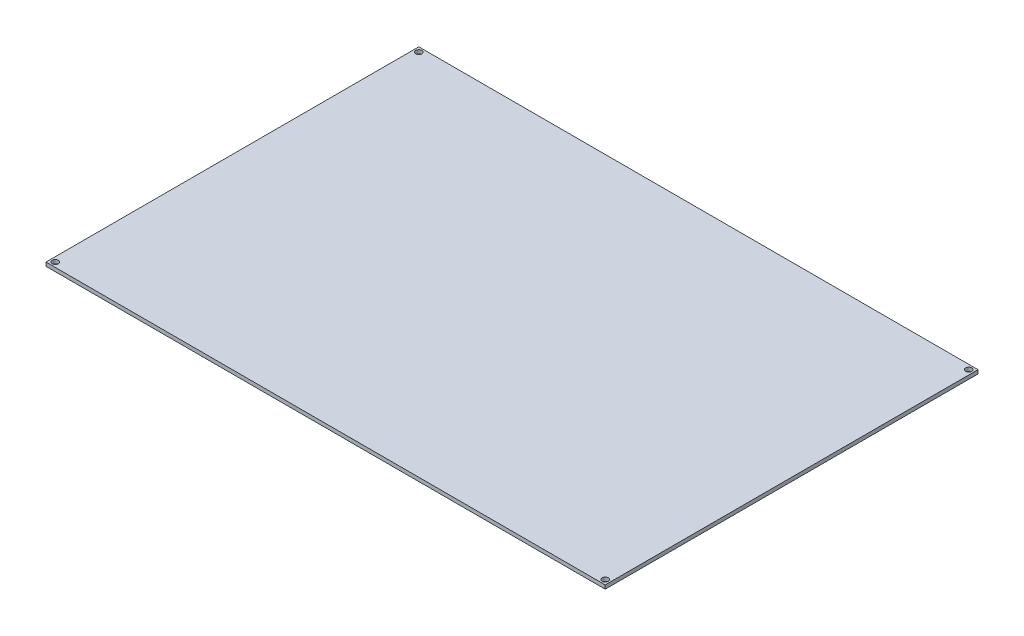
ISO-10303-21;
HEADER;
FILE_DESCRIPTION(('STEP AP214'),'2;1');
FILE_NAME('part.step','',(''),(''),'','','');
FILE_SCHEMA(('AUTOMOTIVE_DESIGN { 1 0 10303 214 1 1 1 1 }'));
ENDSEC;
DATA;
#1=APPLICATION_CONTEXT('core data for automotive mechanical design processes');
#2=APPLICATION_PROTOCOL_DEFINITION('international standard','automotive_design',2000,#1);
#3=PRODUCT_CONTEXT('',#1,'mechanical');
#4=PRODUCT('Part','Part','',(#3));
#5=PRODUCT_RELATED_PRODUCT_CATEGORY('part','',(#4));
#6=PRODUCT_DEFINITION_FORMATION('','',#4);
#7=PRODUCT_DEFINITION_CONTEXT('part definition',#1,'design');
#8=PRODUCT_DEFINITION('design','',#6,#7);
#9=PRODUCT_DEFINITION_SHAPE('','',#8);
#10=(LENGTH_UNIT() NAMED_UNIT(*) SI_UNIT(.MILLI.,.METRE.));
#11=(NAMED_UNIT(*) PLANE_ANGLE_UNIT() SI_UNIT($,.RADIAN.));
#12=(NAMED_UNIT(*) SI_UNIT($,.STERADIAN.) SOLID_ANGLE_UNIT());
#13=UNCERTAINTY_MEASURE_WITH_UNIT(LENGTH_MEASURE(1.E-05),#10,'distance_accuracy_value','');
#14=(GEOMETRIC_REPRESENTATION_CONTEXT(3) GLOBAL_UNCERTAINTY_ASSIGNED_CONTEXT((#13)) GLOBAL_UNIT_ASSIGNED_CONTEXT((#10,
#11,#12)) REPRESENTATION_CONTEXT('',''));
#15=CARTESIAN_POINT('',(0.,0.,0.));
#16=DIRECTION('',(0.,0.,1.));
#17=DIRECTION('',(1.,0.,0.));
#18=AXIS2_PLACEMENT_3D('',#15,#16,#17);
#19=CARTESIAN_POINT('',(0.,2.,0.));
#20=DIRECTION('',(0.,-1.,0.));
#21=DIRECTION('',(0.,0.,-1.));
#22=AXIS2_PLACEMENT_3D('',#19,#20,#21);
#23=PLANE('',#22);
#24=DIRECTION('',(0.,0.,1.));
#25=VECTOR('',#24,1.);
#26=CARTESIAN_POINT('',(0.,2.,0.));
#27=LINE('',#26,#25);
#28=CARTESIAN_POINT('',(0.,2.,-200.));
#29=VERTEX_POINT('',#28);
#30=CARTESIAN_POINT('',(0.,2.,0.));
#31=VERTEX_POINT('',#30);
#32=EDGE_CURVE('E84',#29,#31,#27,.T.);
#33=ORIENTED_EDGE('',*,*,#32,.T.);
#34=DIRECTION('',(1.,0.,0.));
#35=VECTOR('',#34,1.);
#36=CARTESIAN_POINT('',(0.,2.,0.));
#37=LINE('',#36,#35);
#38=CARTESIAN_POINT('',(300.,2.,0.));
#39=VERTEX_POINT('',#38);
#40=EDGE_CURVE('E79',#31,#39,#37,.T.);
#41=ORIENTED_EDGE('',*,*,#40,.T.);
#42=DIRECTION('',(0.,0.,-1.));
#43=VECTOR('',#42,1.);
#44=CARTESIAN_POINT('',(300.,2.,0.));
#45=LINE('',#44,#43);
#46=CARTESIAN_POINT('',(300.,2.,-200.));
#47=VERTEX_POINT('',#46);
#48=EDGE_CURVE('E82',#39,#47,#45,.T.);
#49=ORIENTED_EDGE('',*,*,#48,.T.);
#50=DIRECTION('',(-1.,0.,0.));
#51=VECTOR('',#50,1.);
#52=CARTESIAN_POINT('',(0.,2.,-200.));
#53=LINE('',#52,#51);
#54=EDGE_CURVE('E49',#47,#29,#53,.T.);
#55=ORIENTED_EDGE('',*,*,#54,.T.);
#56=EDGE_LOOP('',(#33,#41,#49,#55));
#57=FACE_BOUND('',#56,.T.);
#58=CARTESIAN_POINT('',(2.5,2.,-2.5));
#59=DIRECTION('',(0.,1.,0.));
#60=DIRECTION('',(0.,0.,1.));
#61=AXIS2_PLACEMENT_3D('',#58,#59,#60);
#62=CIRCLE('',#61,1.65);
#63=CARTESIAN_POINT('',(2.5,2.,-0.849999999999999));
#64=VERTEX_POINT('',#63);
#65=EDGE_CURVE('E99',#64,#64,#62,.T.);
#66=ORIENTED_EDGE('',*,*,#65,.F.);
#67=EDGE_LOOP('',(#66));
#68=FACE_BOUND('',#67,.T.);
#69=CARTESIAN_POINT('',(297.5,2.,-2.5));
#70=DIRECTION('',(0.,1.,0.));
#71=DIRECTION('',(0.,0.,-1.));
#72=AXIS2_PLACEMENT_3D('',#69,#70,#71);
#73=CIRCLE('',#72,1.64999999999999);
#74=CARTESIAN_POINT('',(297.5,2.,-4.14999999999999));
#75=VERTEX_POINT('',#74);
#76=EDGE_CURVE('E114',#75,#75,#73,.T.);
#77=ORIENTED_EDGE('',*,*,#76,.F.);
#78=EDGE_LOOP('',(#77));
#79=FACE_BOUND('',#78,.T.);
#80=CARTESIAN_POINT('',(297.5,2.,-197.5));
#81=DIRECTION('',(0.,1.,0.));
#82=DIRECTION('',(0.,0.,1.));
#83=AXIS2_PLACEMENT_3D('',#80,#81,#82);
#84=CIRCLE('',#83,1.64999999999999);
#85=CARTESIAN_POINT('',(297.5,2.,-195.85));
#86=VERTEX_POINT('',#85);
#87=EDGE_CURVE('E120',#86,#86,#84,.T.);
#88=ORIENTED_EDGE('',*,*,#87,.F.);
#89=EDGE_LOOP('',(#88));
#90=FACE_BOUND('',#89,.T.);
#91=CARTESIAN_POINT('',(2.5,2.,-197.5));
#92=DIRECTION('',(0.,1.,0.));
#93=DIRECTION('',(0.,0.,-1.));
#94=AXIS2_PLACEMENT_3D('',#91,#92,#93);
#95=CIRCLE('',#94,1.65);
#96=CARTESIAN_POINT('',(2.5,2.,-199.15));
#97=VERTEX_POINT('',#96);
#98=EDGE_CURVE('E126',#97,#97,#95,.T.);
#99=ORIENTED_EDGE('',*,*,#98,.F.);
#100=EDGE_LOOP('',(#99));
#101=FACE_BOUND('',#100,.T.);
#102=ADVANCED_FACE('F32',(#57,#68,#79,#90,#101),#23,.F.);
#103=CARTESIAN_POINT('',(0.,0.,0.));
#104=DIRECTION('',(0.,-1.,0.));
#105=DIRECTION('',(0.,0.,-1.));
#106=AXIS2_PLACEMENT_3D('',#103,#104,#105);
#107=PLANE('',#106);
#108=CARTESIAN_POINT('',(297.5,0.,-197.5));
#109=DIRECTION('',(0.,1.,0.));
#110=DIRECTION('',(0.,0.,1.));
#111=AXIS2_PLACEMENT_3D('',#108,#109,#110);
#112=CIRCLE('',#111,1.64999999999999);
#113=CARTESIAN_POINT('',(297.5,0.,-195.85));
#114=VERTEX_POINT('',#113);
#115=EDGE_CURVE('E123',#114,#114,#112,.T.);
#116=ORIENTED_EDGE('',*,*,#115,.T.);
#117=EDGE_LOOP('',(#116));
#118=FACE_BOUND('',#117,.T.);
#119=CARTESIAN_POINT('',(2.5,0.,-2.5));
#120=DIRECTION('',(0.,1.,0.));
#121=DIRECTION('',(0.,0.,1.));
#122=AXIS2_PLACEMENT_3D('',#119,#120,#121);
#123=CIRCLE('',#122,1.65);
#124=CARTESIAN_POINT('',(2.5,0.,-0.849999999999999));
#125=VERTEX_POINT('',#124);
#126=EDGE_CURVE('E111',#125,#125,#123,.T.);
#127=ORIENTED_EDGE('',*,*,#126,.T.);
#128=EDGE_LOOP('',(#127));
#129=FACE_BOUND('',#128,.T.);
#130=DIRECTION('',(0.,0.,1.));
#131=VECTOR('',#130,1.);
#132=CARTESIAN_POINT('',(0.,0.,0.));
#133=LINE('',#132,#131);
#134=CARTESIAN_POINT('',(0.,0.,-200.));
#135=VERTEX_POINT('',#134);
#136=CARTESIAN_POINT('',(0.,0.,0.));
#137=VERTEX_POINT('',#136);
#138=EDGE_CURVE('E96',#135,#137,#133,.T.);
#139=ORIENTED_EDGE('',*,*,#138,.F.);
#140=DIRECTION('',(-1.,0.,0.));
#141=VECTOR('',#140,1.);
#142=CARTESIAN_POINT('',(0.,0.,-200.));
#143=LINE('',#142,#141);
#144=CARTESIAN_POINT('',(300.,0.,-200.));
#145=VERTEX_POINT('',#144);
#146=EDGE_CURVE('E72',#145,#135,#143,.T.);
#147=ORIENTED_EDGE('',*,*,#146,.F.);
#148=DIRECTION('',(0.,0.,-1.));
#149=VECTOR('',#148,1.);
#150=CARTESIAN_POINT('',(300.,0.,0.));
#151=LINE('',#150,#149);
#152=CARTESIAN_POINT('',(300.,0.,0.));
#153=VERTEX_POINT('',#152);
#154=EDGE_CURVE('E66',#153,#145,#151,.T.);
#155=ORIENTED_EDGE('',*,*,#154,.F.);
#156=DIRECTION('',(1.,0.,0.));
#157=VECTOR('',#156,1.);
#158=CARTESIAN_POINT('',(0.,0.,0.));
#159=LINE('',#158,#157);
#160=EDGE_CURVE('E88',#137,#153,#159,.T.);
#161=ORIENTED_EDGE('',*,*,#160,.F.);
#162=EDGE_LOOP('',(#139,#147,#155,#161));
#163=FACE_BOUND('',#162,.T.);
#164=CARTESIAN_POINT('',(297.5,0.,-2.5));
#165=DIRECTION('',(0.,1.,0.));
#166=DIRECTION('',(0.,0.,-1.));
#167=AXIS2_PLACEMENT_3D('',#164,#165,#166);
#168=CIRCLE('',#167,1.64999999999999);
#169=CARTESIAN_POINT('',(297.5,0.,-4.14999999999999));
#170=VERTEX_POINT('',#169);
#171=EDGE_CURVE('E117',#170,#170,#168,.T.);
#172=ORIENTED_EDGE('',*,*,#171,.T.);
#173=EDGE_LOOP('',(#172));
#174=FACE_BOUND('',#173,.T.);
#175=CARTESIAN_POINT('',(2.5,0.,-197.5));
#176=DIRECTION('',(0.,1.,0.));
#177=DIRECTION('',(0.,0.,-1.));
#178=AXIS2_PLACEMENT_3D('',#175,#176,#177);
#179=CIRCLE('',#178,1.65);
#180=CARTESIAN_POINT('',(2.5,0.,-199.15));
#181=VERTEX_POINT('',#180);
#182=EDGE_CURVE('E129',#181,#181,#179,.T.);
#183=ORIENTED_EDGE('',*,*,#182,.T.);
#184=EDGE_LOOP('',(#183));
#185=FACE_BOUND('',#184,.T.);
#186=ADVANCED_FACE('F107',(#118,#129,#163,#174,#185),#107,.T.);
#187=CARTESIAN_POINT('',(0.,2.,0.));
#188=DIRECTION('',(1.,0.,0.));
#189=DIRECTION('',(0.,0.,-1.));
#190=AXIS2_PLACEMENT_3D('',#187,#188,#189);
#191=PLANE('',#190);
#192=ORIENTED_EDGE('',*,*,#138,.T.);
#193=DIRECTION('',(0.,-1.,0.));
#194=VECTOR('',#193,1.);
#195=CARTESIAN_POINT('',(0.,2.,0.));
#196=LINE('',#195,#194);
#197=EDGE_CURVE('E11',#31,#137,#196,.T.);
#198=ORIENTED_EDGE('',*,*,#197,.F.);
#199=ORIENTED_EDGE('',*,*,#32,.F.);
#200=DIRECTION('',(0.,-1.,0.));
#201=VECTOR('',#200,1.);
#202=CARTESIAN_POINT('',(0.,2.,-200.));
#203=LINE('',#202,#201);
#204=EDGE_CURVE('E92',#29,#135,#203,.T.);
#205=ORIENTED_EDGE('',*,*,#204,.T.);
#206=EDGE_LOOP('',(#192,#198,#199,#205));
#207=FACE_BOUND('',#206,.T.);
#208=ADVANCED_FACE('F34',(#207),#191,.F.);
#209=CARTESIAN_POINT('',(0.,2.,0.));
#210=DIRECTION('',(0.,0.,-1.));
#211=DIRECTION('',(-1.,0.,0.));
#212=AXIS2_PLACEMENT_3D('',#209,#210,#211);
#213=PLANE('',#212);
#214=ORIENTED_EDGE('',*,*,#160,.T.);
#215=DIRECTION('',(0.,-1.,0.));
#216=VECTOR('',#215,1.);
#217=CARTESIAN_POINT('',(300.,2.,0.));
#218=LINE('',#217,#216);
#219=EDGE_CURVE('E41',#39,#153,#218,.T.);
#220=ORIENTED_EDGE('',*,*,#219,.F.);
#221=ORIENTED_EDGE('',*,*,#40,.F.);
#222=ORIENTED_EDGE('',*,*,#197,.T.);
#223=EDGE_LOOP('',(#214,#220,#221,#222));
#224=FACE_BOUND('',#223,.T.);
#225=ADVANCED_FACE('F87',(#224),#213,.F.);
#226=CARTESIAN_POINT('',(300.,2.,0.));
#227=DIRECTION('',(-1.,0.,0.));
#228=DIRECTION('',(0.,0.,1.));
#229=AXIS2_PLACEMENT_3D('',#226,#227,#228);
#230=PLANE('',#229);
#231=ORIENTED_EDGE('',*,*,#154,.T.);
#232=DIRECTION('',(0.,-1.,0.));
#233=VECTOR('',#232,1.);
#234=CARTESIAN_POINT('',(300.,2.,-200.));
#235=LINE('',#234,#233);
#236=EDGE_CURVE('E89',#47,#145,#235,.T.);
#237=ORIENTED_EDGE('',*,*,#236,.F.);
#238=ORIENTED_EDGE('',*,*,#48,.F.);
#239=ORIENTED_EDGE('',*,*,#219,.T.);
#240=EDGE_LOOP('',(#231,#237,#238,#239));
#241=FACE_BOUND('',#240,.T.);
#242=ADVANCED_FACE('F90',(#241),#230,.F.);
#243=CARTESIAN_POINT('',(0.,2.,-200.));
#244=DIRECTION('',(0.,0.,1.));
#245=DIRECTION('',(1.,0.,0.));
#246=AXIS2_PLACEMENT_3D('',#243,#244,#245);
#247=PLANE('',#246);
#248=ORIENTED_EDGE('',*,*,#146,.T.);
#249=ORIENTED_EDGE('',*,*,#204,.F.);
#250=ORIENTED_EDGE('',*,*,#54,.F.);
#251=ORIENTED_EDGE('',*,*,#236,.T.);
#252=EDGE_LOOP('',(#248,#249,#250,#251));
#253=FACE_BOUND('',#252,.T.);
#254=ADVANCED_FACE('F104',(#253),#247,.F.);
#255=CARTESIAN_POINT('',(2.5,2.,-2.5));
#256=DIRECTION('',(0.,-1.,0.));
#257=DIRECTION('',(0.,0.,-1.));
#258=AXIS2_PLACEMENT_3D('',#255,#256,#257);
#259=CYLINDRICAL_SURFACE('',#258,1.65);
#260=ORIENTED_EDGE('',*,*,#65,.T.);
#261=EDGE_LOOP('',(#260));
#262=FACE_BOUND('',#261,.T.);
#263=ORIENTED_EDGE('',*,*,#126,.F.);
#264=EDGE_LOOP('',(#263));
#265=FACE_BOUND('',#264,.T.);
#266=ADVANCED_FACE('F146',(#262,#265),#259,.F.);
#267=CARTESIAN_POINT('',(297.5,2.,-2.5));
#268=DIRECTION('',(0.,-1.,0.));
#269=DIRECTION('',(0.,0.,-1.));
#270=AXIS2_PLACEMENT_3D('',#267,#268,#269);
#271=CYLINDRICAL_SURFACE('',#270,1.64999999999999);
#272=ORIENTED_EDGE('',*,*,#76,.T.);
#273=EDGE_LOOP('',(#272));
#274=FACE_BOUND('',#273,.T.);
#275=ORIENTED_EDGE('',*,*,#171,.F.);
#276=EDGE_LOOP('',(#275));
#277=FACE_BOUND('',#276,.T.);
#278=ADVANCED_FACE('F192',(#274,#277),#271,.F.);
#279=CARTESIAN_POINT('',(297.5,2.,-197.5));
#280=DIRECTION('',(0.,-1.,0.));
#281=DIRECTION('',(0.,0.,-1.));
#282=AXIS2_PLACEMENT_3D('',#279,#280,#281);
#283=CYLINDRICAL_SURFACE('',#282,1.64999999999999);
#284=ORIENTED_EDGE('',*,*,#87,.T.);
#285=EDGE_LOOP('',(#284));
#286=FACE_BOUND('',#285,.T.);
#287=ORIENTED_EDGE('',*,*,#115,.F.);
#288=EDGE_LOOP('',(#287));
#289=FACE_BOUND('',#288,.T.);
#290=ADVANCED_FACE('F200',(#286,#289),#283,.F.);
#291=CARTESIAN_POINT('',(2.5,2.,-197.5));
#292=DIRECTION('',(0.,-1.,0.));
#293=DIRECTION('',(0.,0.,-1.));
#294=AXIS2_PLACEMENT_3D('',#291,#292,#293);
#295=CYLINDRICAL_SURFACE('',#294,1.65);
#296=ORIENTED_EDGE('',*,*,#98,.T.);
#297=EDGE_LOOP('',(#296));
#298=FACE_BOUND('',#297,.T.);
#299=ORIENTED_EDGE('',*,*,#182,.F.);
#300=EDGE_LOOP('',(#299));
#301=FACE_BOUND('',#300,.T.);
#302=ADVANCED_FACE('F135',(#298,#301),#295,.F.);
#303=CLOSED_SHELL('',(#102,#186,#208,#225,#242,#254,#266,#278,#290,#302));
#304=MANIFOLD_SOLID_BREP('B2',#303);
#305=ADVANCED_BREP_SHAPE_REPRESENTATION('',(#18,#304),#14);
#306=SHAPE_DEFINITION_REPRESENTATION(#9,#305);
ENDSEC;
END-ISO-10303-21;
